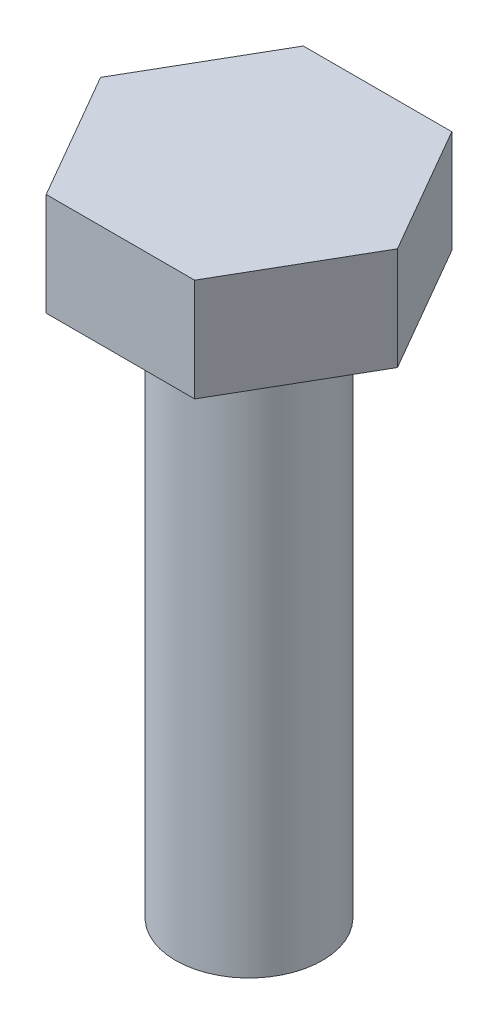
ISO-10303-21;
HEADER;
FILE_DESCRIPTION(('STEP AP214'),'2;1');
FILE_NAME('part.step','',(''),(''),'','','');
FILE_SCHEMA(('AUTOMOTIVE_DESIGN { 1 0 10303 214 1 1 1 1 }'));
ENDSEC;
DATA;
#1=APPLICATION_CONTEXT('core data for automotive mechanical design processes');
#2=APPLICATION_PROTOCOL_DEFINITION('international standard','automotive_design',2000,#1);
#3=PRODUCT_CONTEXT('',#1,'mechanical');
#4=PRODUCT('Part','Part','',(#3));
#5=PRODUCT_RELATED_PRODUCT_CATEGORY('part','',(#4));
#6=PRODUCT_DEFINITION_FORMATION('','',#4);
#7=PRODUCT_DEFINITION_CONTEXT('part definition',#1,'design');
#8=PRODUCT_DEFINITION('design','',#6,#7);
#9=PRODUCT_DEFINITION_SHAPE('','',#8);
#10=(LENGTH_UNIT() NAMED_UNIT(*) SI_UNIT(.MILLI.,.METRE.));
#11=(NAMED_UNIT(*) PLANE_ANGLE_UNIT() SI_UNIT($,.RADIAN.));
#12=(NAMED_UNIT(*) SI_UNIT($,.STERADIAN.) SOLID_ANGLE_UNIT());
#13=UNCERTAINTY_MEASURE_WITH_UNIT(LENGTH_MEASURE(1.E-05),#10,'distance_accuracy_value','');
#14=(GEOMETRIC_REPRESENTATION_CONTEXT(3) GLOBAL_UNCERTAINTY_ASSIGNED_CONTEXT((#13)) GLOBAL_UNIT_ASSIGNED_CONTEXT((#10,
#11,#12)) REPRESENTATION_CONTEXT('',''));
#15=CARTESIAN_POINT('',(0.,0.,0.));
#16=DIRECTION('',(0.,0.,1.));
#17=DIRECTION('',(1.,0.,0.));
#18=AXIS2_PLACEMENT_3D('',#15,#16,#17);
#19=CARTESIAN_POINT('',(0.,15.,0.));
#20=DIRECTION('',(0.,-1.,0.));
#21=DIRECTION('',(0.,0.,-1.));
#22=AXIS2_PLACEMENT_3D('',#19,#20,#21);
#23=CYLINDRICAL_SURFACE('',#22,2.);
#24=CARTESIAN_POINT('',(0.,15.,0.));
#25=DIRECTION('',(0.,1.,0.));
#26=DIRECTION('',(0.,0.,1.));
#27=AXIS2_PLACEMENT_3D('',#24,#25,#26);
#28=CIRCLE('',#27,2.);
#29=CARTESIAN_POINT('',(0.,15.,2.));
#30=VERTEX_POINT('',#29);
#31=EDGE_CURVE('E11',#30,#30,#28,.T.);
#32=ORIENTED_EDGE('',*,*,#31,.F.);
#33=EDGE_LOOP('',(#32));
#34=FACE_BOUND('',#33,.T.);
#35=CARTESIAN_POINT('',(0.,0.,0.));
#36=DIRECTION('',(0.,1.,0.));
#37=DIRECTION('',(0.,0.,1.));
#38=AXIS2_PLACEMENT_3D('',#35,#36,#37);
#39=CIRCLE('',#38,2.);
#40=CARTESIAN_POINT('',(0.,0.,2.));
#41=VERTEX_POINT('',#40);
#42=EDGE_CURVE('E37',#41,#41,#39,.T.);
#43=ORIENTED_EDGE('',*,*,#42,.T.);
#44=EDGE_LOOP('',(#43));
#45=FACE_BOUND('',#44,.T.);
#46=ADVANCED_FACE('F34',(#34,#45),#23,.T.);
#47=CARTESIAN_POINT('',(0.,0.,0.));
#48=DIRECTION('',(0.,1.,0.));
#49=DIRECTION('',(0.,0.,1.));
#50=AXIS2_PLACEMENT_3D('',#47,#48,#49);
#51=PLANE('',#50);
#52=ORIENTED_EDGE('',*,*,#42,.F.);
#53=EDGE_LOOP('',(#52));
#54=FACE_BOUND('',#53,.T.);
#55=ADVANCED_FACE('F142',(#54),#51,.F.);
#56=CARTESIAN_POINT('',(2.02072594216369,17.8,3.5));
#57=DIRECTION('',(-0.866025403784439,0.,-0.5));
#58=DIRECTION('',(-0.5,0.,0.866025403784439));
#59=AXIS2_PLACEMENT_3D('',#56,#57,#58);
#60=PLANE('',#59);
#61=DIRECTION('',(0.5,0.,-0.866025403784439));
#62=VECTOR('',#61,1.);
#63=CARTESIAN_POINT('',(2.02072594216369,15.,3.5));
#64=LINE('',#63,#62);
#65=CARTESIAN_POINT('',(2.02072594216369,15.,3.5));
#66=VERTEX_POINT('',#65);
#67=CARTESIAN_POINT('',(4.04145188432738,15.,0.));
#68=VERTEX_POINT('',#67);
#69=EDGE_CURVE('E119',#66,#68,#64,.T.);
#70=ORIENTED_EDGE('',*,*,#69,.T.);
#71=DIRECTION('',(0.,-1.,0.));
#72=VECTOR('',#71,1.);
#73=CARTESIAN_POINT('',(4.04145188432738,17.8,0.));
#74=LINE('',#73,#72);
#75=CARTESIAN_POINT('',(4.04145188432738,17.8,0.));
#76=VERTEX_POINT('',#75);
#77=EDGE_CURVE('E136',#76,#68,#74,.T.);
#78=ORIENTED_EDGE('',*,*,#77,.F.);
#79=DIRECTION('',(0.5,0.,-0.866025403784439));
#80=VECTOR('',#79,1.);
#81=CARTESIAN_POINT('',(2.02072594216369,17.8,3.5));
#82=LINE('',#81,#80);
#83=CARTESIAN_POINT('',(2.02072594216369,17.8,3.5));
#84=VERTEX_POINT('',#83);
#85=EDGE_CURVE('E129',#84,#76,#82,.T.);
#86=ORIENTED_EDGE('',*,*,#85,.F.);
#87=DIRECTION('',(0.,-1.,0.));
#88=VECTOR('',#87,1.);
#89=CARTESIAN_POINT('',(2.02072594216369,17.8,3.5));
#90=LINE('',#89,#88);
#91=EDGE_CURVE('E115',#84,#66,#90,.T.);
#92=ORIENTED_EDGE('',*,*,#91,.T.);
#93=EDGE_LOOP('',(#70,#78,#86,#92));
#94=FACE_BOUND('',#93,.T.);
#95=ADVANCED_FACE('F144',(#94),#60,.F.);
#96=CARTESIAN_POINT('',(4.04145188432738,17.8,0.));
#97=DIRECTION('',(-0.866025403784438,0.,0.5));
#98=DIRECTION('',(0.5,0.,0.866025403784438));
#99=AXIS2_PLACEMENT_3D('',#96,#97,#98);
#100=PLANE('',#99);
#101=DIRECTION('',(-0.5,0.,-0.866025403784438));
#102=VECTOR('',#101,1.);
#103=CARTESIAN_POINT('',(4.04145188432738,15.,0.));
#104=LINE('',#103,#102);
#105=CARTESIAN_POINT('',(2.02072594216369,15.,-3.5));
#106=VERTEX_POINT('',#105);
#107=EDGE_CURVE('E122',#68,#106,#104,.T.);
#108=ORIENTED_EDGE('',*,*,#107,.T.);
#109=DIRECTION('',(0.,-1.,0.));
#110=VECTOR('',#109,1.);
#111=CARTESIAN_POINT('',(2.02072594216369,17.8,-3.5));
#112=LINE('',#111,#110);
#113=CARTESIAN_POINT('',(2.02072594216369,17.8,-3.5));
#114=VERTEX_POINT('',#113);
#115=EDGE_CURVE('E133',#114,#106,#112,.T.);
#116=ORIENTED_EDGE('',*,*,#115,.F.);
#117=DIRECTION('',(-0.5,0.,-0.866025403784438));
#118=VECTOR('',#117,1.);
#119=CARTESIAN_POINT('',(4.04145188432738,17.8,0.));
#120=LINE('',#119,#118);
#121=EDGE_CURVE('E88',#76,#114,#120,.T.);
#122=ORIENTED_EDGE('',*,*,#121,.F.);
#123=ORIENTED_EDGE('',*,*,#77,.T.);
#124=EDGE_LOOP('',(#108,#116,#122,#123));
#125=FACE_BOUND('',#124,.T.);
#126=ADVANCED_FACE('F149',(#125),#100,.F.);
#127=CARTESIAN_POINT('',(2.02072594216369,17.8,-3.5));
#128=DIRECTION('',(0.,0.,1.));
#129=DIRECTION('',(1.,0.,0.));
#130=AXIS2_PLACEMENT_3D('',#127,#128,#129);
#131=PLANE('',#130);
#132=DIRECTION('',(-1.,0.,0.));
#133=VECTOR('',#132,1.);
#134=CARTESIAN_POINT('',(2.02072594216369,15.,-3.5));
#135=LINE('',#134,#133);
#136=CARTESIAN_POINT('',(-2.02072594216369,15.,-3.5));
#137=VERTEX_POINT('',#136);
#138=EDGE_CURVE('E124',#106,#137,#135,.T.);
#139=ORIENTED_EDGE('',*,*,#138,.T.);
#140=DIRECTION('',(0.,-1.,0.));
#141=VECTOR('',#140,1.);
#142=CARTESIAN_POINT('',(-2.02072594216369,17.8,-3.5));
#143=LINE('',#142,#141);
#144=CARTESIAN_POINT('',(-2.02072594216369,17.8,-3.5));
#145=VERTEX_POINT('',#144);
#146=EDGE_CURVE('E110',#145,#137,#143,.T.);
#147=ORIENTED_EDGE('',*,*,#146,.F.);
#148=DIRECTION('',(-1.,0.,0.));
#149=VECTOR('',#148,1.);
#150=CARTESIAN_POINT('',(2.02072594216369,17.8,-3.5));
#151=LINE('',#150,#149);
#152=EDGE_CURVE('E101',#114,#145,#151,.T.);
#153=ORIENTED_EDGE('',*,*,#152,.F.);
#154=ORIENTED_EDGE('',*,*,#115,.T.);
#155=EDGE_LOOP('',(#139,#147,#153,#154));
#156=FACE_BOUND('',#155,.T.);
#157=ADVANCED_FACE('F156',(#156),#131,.F.);
#158=CARTESIAN_POINT('',(-2.02072594216369,17.8,-3.5));
#159=DIRECTION('',(0.866025403784439,0.,0.5));
#160=DIRECTION('',(0.5,0.,-0.866025403784439));
#161=AXIS2_PLACEMENT_3D('',#158,#159,#160);
#162=PLANE('',#161);
#163=DIRECTION('',(-0.5,0.,0.866025403784439));
#164=VECTOR('',#163,1.);
#165=CARTESIAN_POINT('',(-2.02072594216369,15.,-3.5));
#166=LINE('',#165,#164);
#167=CARTESIAN_POINT('',(-4.04145188432738,15.,0.));
#168=VERTEX_POINT('',#167);
#169=EDGE_CURVE('E109',#137,#168,#166,.T.);
#170=ORIENTED_EDGE('',*,*,#169,.T.);
#171=DIRECTION('',(0.,-1.,0.));
#172=VECTOR('',#171,1.);
#173=CARTESIAN_POINT('',(-4.04145188432738,17.8,0.));
#174=LINE('',#173,#172);
#175=CARTESIAN_POINT('',(-4.04145188432738,17.8,0.));
#176=VERTEX_POINT('',#175);
#177=EDGE_CURVE('E106',#176,#168,#174,.T.);
#178=ORIENTED_EDGE('',*,*,#177,.F.);
#179=DIRECTION('',(-0.5,0.,0.866025403784439));
#180=VECTOR('',#179,1.);
#181=CARTESIAN_POINT('',(-2.02072594216369,17.8,-3.5));
#182=LINE('',#181,#180);
#183=EDGE_CURVE('E95',#145,#176,#182,.T.);
#184=ORIENTED_EDGE('',*,*,#183,.F.);
#185=ORIENTED_EDGE('',*,*,#146,.T.);
#186=EDGE_LOOP('',(#170,#178,#184,#185));
#187=FACE_BOUND('',#186,.T.);
#188=ADVANCED_FACE('F107',(#187),#162,.F.);
#189=CARTESIAN_POINT('',(-4.04145188432738,17.8,0.));
#190=DIRECTION('',(0.866025403784439,0.,-0.5));
#191=DIRECTION('',(-0.5,0.,-0.866025403784439));
#192=AXIS2_PLACEMENT_3D('',#189,#190,#191);
#193=PLANE('',#192);
#194=DIRECTION('',(0.5,0.,0.866025403784439));
#195=VECTOR('',#194,1.);
#196=CARTESIAN_POINT('',(-4.04145188432738,15.,0.));
#197=LINE('',#196,#195);
#198=CARTESIAN_POINT('',(-2.02072594216369,15.,3.5));
#199=VERTEX_POINT('',#198);
#200=EDGE_CURVE('E73',#168,#199,#197,.T.);
#201=ORIENTED_EDGE('',*,*,#200,.T.);
#202=DIRECTION('',(0.,-1.,0.));
#203=VECTOR('',#202,1.);
#204=CARTESIAN_POINT('',(-2.02072594216369,17.8,3.5));
#205=LINE('',#204,#203);
#206=CARTESIAN_POINT('',(-2.02072594216369,17.8,3.5));
#207=VERTEX_POINT('',#206);
#208=EDGE_CURVE('E111',#207,#199,#205,.T.);
#209=ORIENTED_EDGE('',*,*,#208,.F.);
#210=DIRECTION('',(0.5,0.,0.866025403784439));
#211=VECTOR('',#210,1.);
#212=CARTESIAN_POINT('',(-4.04145188432738,17.8,0.));
#213=LINE('',#212,#211);
#214=EDGE_CURVE('E99',#176,#207,#213,.T.);
#215=ORIENTED_EDGE('',*,*,#214,.F.);
#216=ORIENTED_EDGE('',*,*,#177,.T.);
#217=EDGE_LOOP('',(#201,#209,#215,#216));
#218=FACE_BOUND('',#217,.T.);
#219=ADVANCED_FACE('F113',(#218),#193,.F.);
#220=CARTESIAN_POINT('',(-2.02072594216369,17.8,3.5));
#221=DIRECTION('',(0.,0.,-1.));
#222=DIRECTION('',(-1.,0.,0.));
#223=AXIS2_PLACEMENT_3D('',#220,#221,#222);
#224=PLANE('',#223);
#225=DIRECTION('',(1.,0.,0.));
#226=VECTOR('',#225,1.);
#227=CARTESIAN_POINT('',(-2.02072594216369,15.,3.5));
#228=LINE('',#227,#226);
#229=EDGE_CURVE('E79',#199,#66,#228,.T.);
#230=ORIENTED_EDGE('',*,*,#229,.T.);
#231=ORIENTED_EDGE('',*,*,#91,.F.);
#232=DIRECTION('',(1.,0.,0.));
#233=VECTOR('',#232,1.);
#234=CARTESIAN_POINT('',(-2.02072594216369,17.8,3.5));
#235=LINE('',#234,#233);
#236=EDGE_CURVE('E50',#207,#84,#235,.T.);
#237=ORIENTED_EDGE('',*,*,#236,.F.);
#238=ORIENTED_EDGE('',*,*,#208,.T.);
#239=EDGE_LOOP('',(#230,#231,#237,#238));
#240=FACE_BOUND('',#239,.T.);
#241=ADVANCED_FACE('F164',(#240),#224,.F.);
#242=CARTESIAN_POINT('',(0.,17.8,0.));
#243=DIRECTION('',(0.,1.,0.));
#244=DIRECTION('',(0.,0.,1.));
#245=AXIS2_PLACEMENT_3D('',#242,#243,#244);
#246=PLANE('',#245);
#247=ORIENTED_EDGE('',*,*,#85,.T.);
#248=ORIENTED_EDGE('',*,*,#121,.T.);
#249=ORIENTED_EDGE('',*,*,#152,.T.);
#250=ORIENTED_EDGE('',*,*,#183,.T.);
#251=ORIENTED_EDGE('',*,*,#214,.T.);
#252=ORIENTED_EDGE('',*,*,#236,.T.);
#253=EDGE_LOOP('',(#247,#248,#249,#250,#251,#252));
#254=FACE_BOUND('',#253,.T.);
#255=ADVANCED_FACE('F97',(#254),#246,.T.);
#256=CARTESIAN_POINT('',(0.,15.,0.));
#257=DIRECTION('',(0.,1.,0.));
#258=DIRECTION('',(0.,0.,1.));
#259=AXIS2_PLACEMENT_3D('',#256,#257,#258);
#260=PLANE('',#259);
#261=ORIENTED_EDGE('',*,*,#31,.T.);
#262=EDGE_LOOP('',(#261));
#263=FACE_BOUND('',#262,.T.);
#264=ORIENTED_EDGE('',*,*,#69,.F.);
#265=ORIENTED_EDGE('',*,*,#229,.F.);
#266=ORIENTED_EDGE('',*,*,#200,.F.);
#267=ORIENTED_EDGE('',*,*,#169,.F.);
#268=ORIENTED_EDGE('',*,*,#138,.F.);
#269=ORIENTED_EDGE('',*,*,#107,.F.);
#270=EDGE_LOOP('',(#264,#265,#266,#267,#268,#269));
#271=FACE_BOUND('',#270,.T.);
#272=ADVANCED_FACE('F167',(#263,#271),#260,.F.);
#273=CLOSED_SHELL('',(#46,#55,#95,#126,#157,#188,#219,#241,#255,#272));
#274=MANIFOLD_SOLID_BREP('B2',#273);
#275=ADVANCED_BREP_SHAPE_REPRESENTATION('',(#18,#274),#14);
#276=SHAPE_DEFINITION_REPRESENTATION(#9,#275);
ENDSEC;
END-ISO-10303-21;
